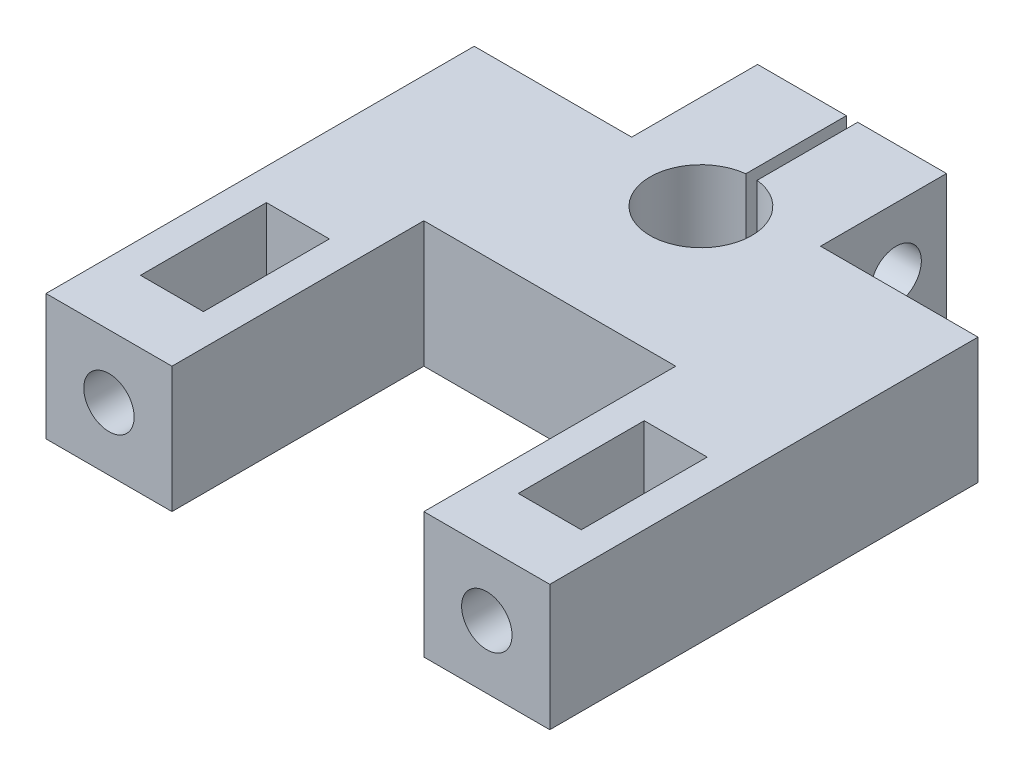
ISO-10303-21;
HEADER;
FILE_DESCRIPTION(('STEP AP214'),'2;1');
FILE_NAME('part.step','',(''),(''),'','','');
FILE_SCHEMA(('AUTOMOTIVE_DESIGN { 1 0 10303 214 1 1 1 1 }'));
ENDSEC;
DATA;
#1=APPLICATION_CONTEXT('core data for automotive mechanical design processes');
#2=APPLICATION_PROTOCOL_DEFINITION('international standard','automotive_design',2000,#1);
#3=PRODUCT_CONTEXT('',#1,'mechanical');
#4=PRODUCT('Part','Part','',(#3));
#5=PRODUCT_RELATED_PRODUCT_CATEGORY('part','',(#4));
#6=PRODUCT_DEFINITION_FORMATION('','',#4);
#7=PRODUCT_DEFINITION_CONTEXT('part definition',#1,'design');
#8=PRODUCT_DEFINITION('design','',#6,#7);
#9=PRODUCT_DEFINITION_SHAPE('','',#8);
#10=(LENGTH_UNIT() NAMED_UNIT(*) SI_UNIT(.MILLI.,.METRE.));
#11=(NAMED_UNIT(*) PLANE_ANGLE_UNIT() SI_UNIT($,.RADIAN.));
#12=(NAMED_UNIT(*) SI_UNIT($,.STERADIAN.) SOLID_ANGLE_UNIT());
#13=UNCERTAINTY_MEASURE_WITH_UNIT(LENGTH_MEASURE(1.E-05),#10,'distance_accuracy_value','');
#14=(GEOMETRIC_REPRESENTATION_CONTEXT(3) GLOBAL_UNCERTAINTY_ASSIGNED_CONTEXT((#13)) GLOBAL_UNIT_ASSIGNED_CONTEXT((#10,
#11,#12)) REPRESENTATION_CONTEXT('',''));
#15=CARTESIAN_POINT('',(0.,0.,0.));
#16=DIRECTION('',(0.,0.,1.));
#17=DIRECTION('',(1.,0.,0.));
#18=AXIS2_PLACEMENT_3D('',#15,#16,#17);
#19=CARTESIAN_POINT('',(-20.,0.,-34.));
#20=DIRECTION('',(0.,0.,-1.));
#21=DIRECTION('',(-1.,0.,0.));
#22=AXIS2_PLACEMENT_3D('',#19,#20,#21);
#23=PLANE('',#22);
#24=DIRECTION('',(0.,1.,0.));
#25=VECTOR('',#24,1.);
#26=CARTESIAN_POINT('',(7.5,-30.,-34.));
#27=LINE('',#26,#25);
#28=CARTESIAN_POINT('',(7.5,0.,-34.));
#29=VERTEX_POINT('',#28);
#30=CARTESIAN_POINT('',(7.5,10.,-34.));
#31=VERTEX_POINT('',#30);
#32=EDGE_CURVE('E286',#29,#31,#27,.T.);
#33=ORIENTED_EDGE('',*,*,#32,.F.);
#34=DIRECTION('',(-1.,0.,0.));
#35=VECTOR('',#34,1.);
#36=CARTESIAN_POINT('',(-20.,0.,-34.));
#37=LINE('',#36,#35);
#38=CARTESIAN_POINT('',(0.45,0.,-34.));
#39=VERTEX_POINT('',#38);
#40=EDGE_CURVE('E322',#29,#39,#37,.T.);
#41=ORIENTED_EDGE('',*,*,#40,.T.);
#42=DIRECTION('',(0.,1.,0.));
#43=VECTOR('',#42,1.);
#44=CARTESIAN_POINT('',(0.45,0.,-34.));
#45=LINE('',#44,#43);
#46=CARTESIAN_POINT('',(0.45,10.,-34.));
#47=VERTEX_POINT('',#46);
#48=EDGE_CURVE('E307',#39,#47,#45,.T.);
#49=ORIENTED_EDGE('',*,*,#48,.T.);
#50=DIRECTION('',(-1.,0.,0.));
#51=VECTOR('',#50,1.);
#52=CARTESIAN_POINT('',(-20.,10.,-34.));
#53=LINE('',#52,#51);
#54=EDGE_CURVE('E326',#31,#47,#53,.T.);
#55=ORIENTED_EDGE('',*,*,#54,.F.);
#56=EDGE_LOOP('',(#33,#41,#49,#55));
#57=FACE_BOUND('',#56,.T.);
#58=ADVANCED_FACE('F34',(#57),#23,.T.);
#59=CARTESIAN_POINT('',(10.,10.,10.));
#60=DIRECTION('',(1.,0.,0.));
#61=DIRECTION('',(0.,0.,-1.));
#62=AXIS2_PLACEMENT_3D('',#59,#60,#61);
#63=PLANE('',#62);
#64=DIRECTION('',(0.,0.,1.));
#65=VECTOR('',#64,1.);
#66=CARTESIAN_POINT('',(10.,0.,10.));
#67=LINE('',#66,#65);
#68=CARTESIAN_POINT('',(10.,0.,-10.));
#69=VERTEX_POINT('',#68);
#70=CARTESIAN_POINT('',(10.,0.,10.));
#71=VERTEX_POINT('',#70);
#72=EDGE_CURVE('E333',#69,#71,#67,.T.);
#73=ORIENTED_EDGE('',*,*,#72,.T.);
#74=DIRECTION('',(0.,-1.,0.));
#75=VECTOR('',#74,1.);
#76=CARTESIAN_POINT('',(10.,10.,10.));
#77=LINE('',#76,#75);
#78=CARTESIAN_POINT('',(10.,10.,10.));
#79=VERTEX_POINT('',#78);
#80=EDGE_CURVE('E380',#79,#71,#77,.T.);
#81=ORIENTED_EDGE('',*,*,#80,.F.);
#82=DIRECTION('',(0.,0.,1.));
#83=VECTOR('',#82,1.);
#84=CARTESIAN_POINT('',(10.,10.,10.));
#85=LINE('',#84,#83);
#86=CARTESIAN_POINT('',(10.,10.,-10.));
#87=VERTEX_POINT('',#86);
#88=EDGE_CURVE('E334',#87,#79,#85,.T.);
#89=ORIENTED_EDGE('',*,*,#88,.F.);
#90=DIRECTION('',(0.,-1.,0.));
#91=VECTOR('',#90,1.);
#92=CARTESIAN_POINT('',(10.,10.,-10.));
#93=LINE('',#92,#91);
#94=EDGE_CURVE('E351',#87,#69,#93,.T.);
#95=ORIENTED_EDGE('',*,*,#94,.T.);
#96=EDGE_LOOP('',(#73,#81,#89,#95));
#97=FACE_BOUND('',#96,.T.);
#98=ADVANCED_FACE('F36',(#97),#63,.F.);
#99=CARTESIAN_POINT('',(10.,10.,10.));
#100=DIRECTION('',(0.,0.,-1.));
#101=DIRECTION('',(-1.,0.,0.));
#102=AXIS2_PLACEMENT_3D('',#99,#100,#101);
#103=PLANE('',#102);
#104=CARTESIAN_POINT('',(15.,5.,10.));
#105=DIRECTION('',(0.,0.,1.));
#106=DIRECTION('',(1.,0.,0.));
#107=AXIS2_PLACEMENT_3D('',#104,#105,#106);
#108=CIRCLE('',#107,2.);
#109=CARTESIAN_POINT('',(17.,5.,10.));
#110=VERTEX_POINT('',#109);
#111=EDGE_CURVE('E324',#110,#110,#108,.T.);
#112=ORIENTED_EDGE('',*,*,#111,.F.);
#113=EDGE_LOOP('',(#112));
#114=FACE_BOUND('',#113,.T.);
#115=DIRECTION('',(1.,0.,0.));
#116=VECTOR('',#115,1.);
#117=CARTESIAN_POINT('',(10.,0.,10.));
#118=LINE('',#117,#116);
#119=CARTESIAN_POINT('',(20.,0.,10.));
#120=VERTEX_POINT('',#119);
#121=EDGE_CURVE('E354',#71,#120,#118,.T.);
#122=ORIENTED_EDGE('',*,*,#121,.T.);
#123=DIRECTION('',(0.,-1.,0.));
#124=VECTOR('',#123,1.);
#125=CARTESIAN_POINT('',(20.,10.,10.));
#126=LINE('',#125,#124);
#127=CARTESIAN_POINT('',(20.,10.,10.));
#128=VERTEX_POINT('',#127);
#129=EDGE_CURVE('E377',#128,#120,#126,.T.);
#130=ORIENTED_EDGE('',*,*,#129,.F.);
#131=DIRECTION('',(1.,0.,0.));
#132=VECTOR('',#131,1.);
#133=CARTESIAN_POINT('',(10.,10.,10.));
#134=LINE('',#133,#132);
#135=EDGE_CURVE('E337',#79,#128,#134,.T.);
#136=ORIENTED_EDGE('',*,*,#135,.F.);
#137=ORIENTED_EDGE('',*,*,#80,.T.);
#138=EDGE_LOOP('',(#122,#130,#136,#137));
#139=FACE_BOUND('',#138,.T.);
#140=ADVANCED_FACE('F428',(#114,#139),#103,.F.);
#141=CARTESIAN_POINT('',(20.,10.,10.));
#142=DIRECTION('',(-1.,0.,0.));
#143=DIRECTION('',(0.,0.,1.));
#144=AXIS2_PLACEMENT_3D('',#141,#142,#143);
#145=PLANE('',#144);
#146=DIRECTION('',(0.,0.,-1.));
#147=VECTOR('',#146,1.);
#148=CARTESIAN_POINT('',(20.,0.,10.));
#149=LINE('',#148,#147);
#150=CARTESIAN_POINT('',(20.,0.,-24.));
#151=VERTEX_POINT('',#150);
#152=EDGE_CURVE('E356',#120,#151,#149,.T.);
#153=ORIENTED_EDGE('',*,*,#152,.T.);
#154=DIRECTION('',(0.,1.,0.));
#155=VECTOR('',#154,1.);
#156=CARTESIAN_POINT('',(20.,-30.,-24.));
#157=LINE('',#156,#155);
#158=CARTESIAN_POINT('',(20.,10.,-24.));
#159=VERTEX_POINT('',#158);
#160=EDGE_CURVE('E289',#151,#159,#157,.T.);
#161=ORIENTED_EDGE('',*,*,#160,.T.);
#162=DIRECTION('',(0.,0.,-1.));
#163=VECTOR('',#162,1.);
#164=CARTESIAN_POINT('',(20.,10.,10.));
#165=LINE('',#164,#163);
#166=EDGE_CURVE('E340',#128,#159,#165,.T.);
#167=ORIENTED_EDGE('',*,*,#166,.F.);
#168=ORIENTED_EDGE('',*,*,#129,.T.);
#169=EDGE_LOOP('',(#153,#161,#167,#168));
#170=FACE_BOUND('',#169,.T.);
#171=ADVANCED_FACE('F497',(#170),#145,.F.);
#172=CARTESIAN_POINT('',(-20.,10.,10.));
#173=DIRECTION('',(1.,0.,0.));
#174=DIRECTION('',(0.,0.,-1.));
#175=AXIS2_PLACEMENT_3D('',#172,#173,#174);
#176=PLANE('',#175);
#177=DIRECTION('',(0.,0.,1.));
#178=VECTOR('',#177,1.);
#179=CARTESIAN_POINT('',(-20.,10.,10.));
#180=LINE('',#179,#178);
#181=CARTESIAN_POINT('',(-20.,10.,-24.));
#182=VERTEX_POINT('',#181);
#183=CARTESIAN_POINT('',(-20.,10.,10.));
#184=VERTEX_POINT('',#183);
#185=EDGE_CURVE('E343',#182,#184,#180,.T.);
#186=ORIENTED_EDGE('',*,*,#185,.F.);
#187=DIRECTION('',(0.,1.,0.));
#188=VECTOR('',#187,1.);
#189=CARTESIAN_POINT('',(-20.,-30.,-24.));
#190=LINE('',#189,#188);
#191=CARTESIAN_POINT('',(-20.,0.,-24.));
#192=VERTEX_POINT('',#191);
#193=EDGE_CURVE('E270',#192,#182,#190,.T.);
#194=ORIENTED_EDGE('',*,*,#193,.F.);
#195=DIRECTION('',(0.,0.,1.));
#196=VECTOR('',#195,1.);
#197=CARTESIAN_POINT('',(-20.,0.,10.));
#198=LINE('',#197,#196);
#199=CARTESIAN_POINT('',(-20.,0.,10.));
#200=VERTEX_POINT('',#199);
#201=EDGE_CURVE('E359',#192,#200,#198,.T.);
#202=ORIENTED_EDGE('',*,*,#201,.T.);
#203=DIRECTION('',(0.,-1.,0.));
#204=VECTOR('',#203,1.);
#205=CARTESIAN_POINT('',(-20.,10.,10.));
#206=LINE('',#205,#204);
#207=EDGE_CURVE('E374',#184,#200,#206,.T.);
#208=ORIENTED_EDGE('',*,*,#207,.F.);
#209=EDGE_LOOP('',(#186,#194,#202,#208));
#210=FACE_BOUND('',#209,.T.);
#211=ADVANCED_FACE('F472',(#210),#176,.F.);
#212=CARTESIAN_POINT('',(-20.,10.,10.));
#213=DIRECTION('',(0.,0.,-1.));
#214=DIRECTION('',(-1.,0.,0.));
#215=AXIS2_PLACEMENT_3D('',#212,#213,#214);
#216=PLANE('',#215);
#217=CARTESIAN_POINT('',(-15.,5.,10.));
#218=DIRECTION('',(0.,0.,1.));
#219=DIRECTION('',(1.,0.,0.));
#220=AXIS2_PLACEMENT_3D('',#217,#218,#219);
#221=CIRCLE('',#220,2.);
#222=CARTESIAN_POINT('',(-13.,5.,10.));
#223=VERTEX_POINT('',#222);
#224=EDGE_CURVE('E330',#223,#223,#221,.T.);
#225=ORIENTED_EDGE('',*,*,#224,.F.);
#226=EDGE_LOOP('',(#225));
#227=FACE_BOUND('',#226,.T.);
#228=DIRECTION('',(1.,0.,0.));
#229=VECTOR('',#228,1.);
#230=CARTESIAN_POINT('',(-20.,0.,10.));
#231=LINE('',#230,#229);
#232=CARTESIAN_POINT('',(-10.,0.,10.));
#233=VERTEX_POINT('',#232);
#234=EDGE_CURVE('E361',#200,#233,#231,.T.);
#235=ORIENTED_EDGE('',*,*,#234,.T.);
#236=DIRECTION('',(0.,-1.,0.));
#237=VECTOR('',#236,1.);
#238=CARTESIAN_POINT('',(-10.,10.,10.));
#239=LINE('',#238,#237);
#240=CARTESIAN_POINT('',(-10.,10.,10.));
#241=VERTEX_POINT('',#240);
#242=EDGE_CURVE('E371',#241,#233,#239,.T.);
#243=ORIENTED_EDGE('',*,*,#242,.F.);
#244=DIRECTION('',(1.,0.,0.));
#245=VECTOR('',#244,1.);
#246=CARTESIAN_POINT('',(-20.,10.,10.));
#247=LINE('',#246,#245);
#248=EDGE_CURVE('E345',#184,#241,#247,.T.);
#249=ORIENTED_EDGE('',*,*,#248,.F.);
#250=ORIENTED_EDGE('',*,*,#207,.T.);
#251=EDGE_LOOP('',(#235,#243,#249,#250));
#252=FACE_BOUND('',#251,.T.);
#253=ADVANCED_FACE('F477',(#227,#252),#216,.F.);
#254=CARTESIAN_POINT('',(-10.,10.,10.));
#255=DIRECTION('',(-1.,0.,0.));
#256=DIRECTION('',(0.,0.,1.));
#257=AXIS2_PLACEMENT_3D('',#254,#255,#256);
#258=PLANE('',#257);
#259=DIRECTION('',(0.,0.,-1.));
#260=VECTOR('',#259,1.);
#261=CARTESIAN_POINT('',(-10.,0.,10.));
#262=LINE('',#261,#260);
#263=CARTESIAN_POINT('',(-10.,0.,-10.));
#264=VERTEX_POINT('',#263);
#265=EDGE_CURVE('E363',#233,#264,#262,.T.);
#266=ORIENTED_EDGE('',*,*,#265,.T.);
#267=DIRECTION('',(0.,-1.,0.));
#268=VECTOR('',#267,1.);
#269=CARTESIAN_POINT('',(-10.,10.,-10.));
#270=LINE('',#269,#268);
#271=CARTESIAN_POINT('',(-10.,10.,-10.));
#272=VERTEX_POINT('',#271);
#273=EDGE_CURVE('E368',#272,#264,#270,.T.);
#274=ORIENTED_EDGE('',*,*,#273,.F.);
#275=DIRECTION('',(0.,0.,-1.));
#276=VECTOR('',#275,1.);
#277=CARTESIAN_POINT('',(-10.,10.,10.));
#278=LINE('',#277,#276);
#279=EDGE_CURVE('E347',#241,#272,#278,.T.);
#280=ORIENTED_EDGE('',*,*,#279,.F.);
#281=ORIENTED_EDGE('',*,*,#242,.T.);
#282=EDGE_LOOP('',(#266,#274,#280,#281));
#283=FACE_BOUND('',#282,.T.);
#284=ADVANCED_FACE('F483',(#283),#258,.F.);
#285=CARTESIAN_POINT('',(-10.,10.,-10.));
#286=DIRECTION('',(0.,0.,-1.));
#287=DIRECTION('',(-1.,0.,0.));
#288=AXIS2_PLACEMENT_3D('',#285,#286,#287);
#289=PLANE('',#288);
#290=DIRECTION('',(1.,0.,0.));
#291=VECTOR('',#290,1.);
#292=CARTESIAN_POINT('',(-10.,0.,-10.));
#293=LINE('',#292,#291);
#294=EDGE_CURVE('E338',#264,#69,#293,.T.);
#295=ORIENTED_EDGE('',*,*,#294,.T.);
#296=ORIENTED_EDGE('',*,*,#94,.F.);
#297=DIRECTION('',(1.,0.,0.));
#298=VECTOR('',#297,1.);
#299=CARTESIAN_POINT('',(-10.,10.,-10.));
#300=LINE('',#299,#298);
#301=EDGE_CURVE('E349',#272,#87,#300,.T.);
#302=ORIENTED_EDGE('',*,*,#301,.F.);
#303=ORIENTED_EDGE('',*,*,#273,.T.);
#304=EDGE_LOOP('',(#295,#296,#302,#303));
#305=FACE_BOUND('',#304,.T.);
#306=ADVANCED_FACE('F487',(#305),#289,.F.);
#307=CARTESIAN_POINT('',(0.,10.,0.));
#308=DIRECTION('',(0.,-1.,0.));
#309=DIRECTION('',(0.,0.,-1.));
#310=AXIS2_PLACEMENT_3D('',#307,#308,#309);
#311=PLANE('',#310);
#312=DIRECTION('',(-1.,0.,0.));
#313=VECTOR('',#312,1.);
#314=CARTESIAN_POINT('',(12.5,10.,-5.));
#315=LINE('',#314,#313);
#316=CARTESIAN_POINT('',(17.5,10.,-5.));
#317=VERTEX_POINT('',#316);
#318=CARTESIAN_POINT('',(12.5,10.,-5.));
#319=VERTEX_POINT('',#318);
#320=EDGE_CURVE('E223',#317,#319,#315,.T.);
#321=ORIENTED_EDGE('',*,*,#320,.F.);
#322=DIRECTION('',(0.,0.,-1.));
#323=VECTOR('',#322,1.);
#324=CARTESIAN_POINT('',(17.5,10.,-5.));
#325=LINE('',#324,#323);
#326=CARTESIAN_POINT('',(17.5,10.,5.));
#327=VERTEX_POINT('',#326);
#328=EDGE_CURVE('E51',#327,#317,#325,.T.);
#329=ORIENTED_EDGE('',*,*,#328,.F.);
#330=DIRECTION('',(1.,0.,0.));
#331=VECTOR('',#330,1.);
#332=CARTESIAN_POINT('',(12.5,10.,5.));
#333=LINE('',#332,#331);
#334=CARTESIAN_POINT('',(12.5,10.,5.));
#335=VERTEX_POINT('',#334);
#336=EDGE_CURVE('E214',#335,#327,#333,.T.);
#337=ORIENTED_EDGE('',*,*,#336,.F.);
#338=DIRECTION('',(0.,0.,1.));
#339=VECTOR('',#338,1.);
#340=CARTESIAN_POINT('',(12.5,10.,-5.));
#341=LINE('',#340,#339);
#342=EDGE_CURVE('E217',#319,#335,#341,.T.);
#343=ORIENTED_EDGE('',*,*,#342,.F.);
#344=EDGE_LOOP('',(#321,#329,#337,#343));
#345=FACE_BOUND('',#344,.T.);
#346=DIRECTION('',(-1.,0.,0.));
#347=VECTOR('',#346,1.);
#348=CARTESIAN_POINT('',(-17.5,10.,-5.));
#349=LINE('',#348,#347);
#350=CARTESIAN_POINT('',(-12.5,10.,-5.));
#351=VERTEX_POINT('',#350);
#352=CARTESIAN_POINT('',(-17.5,10.,-5.));
#353=VERTEX_POINT('',#352);
#354=EDGE_CURVE('E248',#351,#353,#349,.T.);
#355=ORIENTED_EDGE('',*,*,#354,.F.);
#356=DIRECTION('',(0.,0.,-1.));
#357=VECTOR('',#356,1.);
#358=CARTESIAN_POINT('',(-12.5,10.,-5.));
#359=LINE('',#358,#357);
#360=CARTESIAN_POINT('',(-12.5,10.,5.));
#361=VERTEX_POINT('',#360);
#362=EDGE_CURVE('E246',#361,#351,#359,.T.);
#363=ORIENTED_EDGE('',*,*,#362,.F.);
#364=DIRECTION('',(1.,0.,0.));
#365=VECTOR('',#364,1.);
#366=CARTESIAN_POINT('',(-17.5,10.,5.));
#367=LINE('',#366,#365);
#368=CARTESIAN_POINT('',(-17.5,10.,5.));
#369=VERTEX_POINT('',#368);
#370=EDGE_CURVE('E236',#369,#361,#367,.T.);
#371=ORIENTED_EDGE('',*,*,#370,.F.);
#372=DIRECTION('',(0.,0.,1.));
#373=VECTOR('',#372,1.);
#374=CARTESIAN_POINT('',(-17.5,10.,-5.));
#375=LINE('',#374,#373);
#376=EDGE_CURVE('E251',#353,#369,#375,.T.);
#377=ORIENTED_EDGE('',*,*,#376,.F.);
#378=EDGE_LOOP('',(#355,#363,#371,#377));
#379=FACE_BOUND('',#378,.T.);
#380=CARTESIAN_POINT('',(-0.45,10.,-34.));
#381=VERTEX_POINT('',#380);
#382=CARTESIAN_POINT('',(-7.5,10.,-34.));
#383=VERTEX_POINT('',#382);
#384=EDGE_CURVE('E319',#381,#383,#53,.T.);
#385=ORIENTED_EDGE('',*,*,#384,.T.);
#386=DIRECTION('',(0.,0.,-1.));
#387=VECTOR('',#386,1.);
#388=CARTESIAN_POINT('',(-7.5,10.,-34.));
#389=LINE('',#388,#387);
#390=CARTESIAN_POINT('',(-7.5,10.,-24.));
#391=VERTEX_POINT('',#390);
#392=EDGE_CURVE('E268',#391,#383,#389,.T.);
#393=ORIENTED_EDGE('',*,*,#392,.F.);
#394=DIRECTION('',(1.,0.,0.));
#395=VECTOR('',#394,1.);
#396=CARTESIAN_POINT('',(-20.,10.,-24.));
#397=LINE('',#396,#395);
#398=EDGE_CURVE('E265',#182,#391,#397,.T.);
#399=ORIENTED_EDGE('',*,*,#398,.F.);
#400=ORIENTED_EDGE('',*,*,#185,.T.);
#401=ORIENTED_EDGE('',*,*,#248,.T.);
#402=ORIENTED_EDGE('',*,*,#279,.T.);
#403=ORIENTED_EDGE('',*,*,#301,.T.);
#404=ORIENTED_EDGE('',*,*,#88,.T.);
#405=ORIENTED_EDGE('',*,*,#135,.T.);
#406=ORIENTED_EDGE('',*,*,#166,.T.);
#407=DIRECTION('',(1.,0.,0.));
#408=VECTOR('',#407,1.);
#409=CARTESIAN_POINT('',(7.5,10.,-24.));
#410=LINE('',#409,#408);
#411=CARTESIAN_POINT('',(7.5,10.,-24.));
#412=VERTEX_POINT('',#411);
#413=EDGE_CURVE('E283',#412,#159,#410,.T.);
#414=ORIENTED_EDGE('',*,*,#413,.F.);
#415=DIRECTION('',(0.,0.,1.));
#416=VECTOR('',#415,1.);
#417=CARTESIAN_POINT('',(7.5,10.,-34.));
#418=LINE('',#417,#416);
#419=EDGE_CURVE('E280',#31,#412,#418,.T.);
#420=ORIENTED_EDGE('',*,*,#419,.F.);
#421=ORIENTED_EDGE('',*,*,#54,.T.);
#422=DIRECTION('',(0.,0.,-1.));
#423=VECTOR('',#422,1.);
#424=CARTESIAN_POINT('',(0.45,10.,-22.));
#425=LINE('',#424,#423);
#426=CARTESIAN_POINT('',(0.45,10.,-26.0148598979292));
#427=VERTEX_POINT('',#426);
#428=EDGE_CURVE('E299',#427,#47,#425,.T.);
#429=ORIENTED_EDGE('',*,*,#428,.F.);
#430=CARTESIAN_POINT('',(0.,10.,-22.));
#431=DIRECTION('',(0.,1.,0.));
#432=DIRECTION('',(0.,0.,1.));
#433=AXIS2_PLACEMENT_3D('',#430,#431,#432);
#434=CIRCLE('',#433,4.04);
#435=CARTESIAN_POINT('',(-0.45,10.,-26.0148598979292));
#436=VERTEX_POINT('',#435);
#437=EDGE_CURVE('E313',#436,#427,#434,.T.);
#438=ORIENTED_EDGE('',*,*,#437,.F.);
#439=DIRECTION('',(0.,0.,1.));
#440=VECTOR('',#439,1.);
#441=CARTESIAN_POINT('',(-0.45,10.,-22.));
#442=LINE('',#441,#440);
#443=EDGE_CURVE('E304',#381,#436,#442,.T.);
#444=ORIENTED_EDGE('',*,*,#443,.F.);
#445=EDGE_LOOP('',(#385,#393,#399,#400,#401,#402,#403,#404,#405,#406,#414,#420,#421,#429,#438,#444));
#446=FACE_BOUND('',#445,.T.);
#447=ADVANCED_FACE('F456',(#345,#379,#446),#311,.F.);
#448=CARTESIAN_POINT('',(0.,0.,0.));
#449=DIRECTION('',(0.,-1.,0.));
#450=DIRECTION('',(0.,0.,-1.));
#451=AXIS2_PLACEMENT_3D('',#448,#449,#450);
#452=PLANE('',#451);
#453=DIRECTION('',(0.,0.,-1.));
#454=VECTOR('',#453,1.);
#455=CARTESIAN_POINT('',(17.5,0.,-5.));
#456=LINE('',#455,#454);
#457=CARTESIAN_POINT('',(17.5,0.,5.));
#458=VERTEX_POINT('',#457);
#459=CARTESIAN_POINT('',(17.5,0.,-5.));
#460=VERTEX_POINT('',#459);
#461=EDGE_CURVE('E198',#458,#460,#456,.T.);
#462=ORIENTED_EDGE('',*,*,#461,.T.);
#463=DIRECTION('',(-1.,0.,0.));
#464=VECTOR('',#463,1.);
#465=CARTESIAN_POINT('',(12.5,0.,-5.));
#466=LINE('',#465,#464);
#467=CARTESIAN_POINT('',(12.5,0.,-5.));
#468=VERTEX_POINT('',#467);
#469=EDGE_CURVE('E207',#460,#468,#466,.T.);
#470=ORIENTED_EDGE('',*,*,#469,.T.);
#471=DIRECTION('',(0.,0.,1.));
#472=VECTOR('',#471,1.);
#473=CARTESIAN_POINT('',(12.5,0.,-5.));
#474=LINE('',#473,#472);
#475=CARTESIAN_POINT('',(12.5,0.,5.));
#476=VERTEX_POINT('',#475);
#477=EDGE_CURVE('E59',#468,#476,#474,.T.);
#478=ORIENTED_EDGE('',*,*,#477,.T.);
#479=DIRECTION('',(1.,0.,0.));
#480=VECTOR('',#479,1.);
#481=CARTESIAN_POINT('',(12.5,0.,5.));
#482=LINE('',#481,#480);
#483=EDGE_CURVE('E204',#476,#458,#482,.T.);
#484=ORIENTED_EDGE('',*,*,#483,.T.);
#485=EDGE_LOOP('',(#462,#470,#478,#484));
#486=FACE_BOUND('',#485,.T.);
#487=DIRECTION('',(0.,0.,-1.));
#488=VECTOR('',#487,1.);
#489=CARTESIAN_POINT('',(-12.5,0.,-5.));
#490=LINE('',#489,#488);
#491=CARTESIAN_POINT('',(-12.5,0.,5.));
#492=VERTEX_POINT('',#491);
#493=CARTESIAN_POINT('',(-12.5,0.,-5.));
#494=VERTEX_POINT('',#493);
#495=EDGE_CURVE('E232',#492,#494,#490,.T.);
#496=ORIENTED_EDGE('',*,*,#495,.T.);
#497=DIRECTION('',(-1.,0.,0.));
#498=VECTOR('',#497,1.);
#499=CARTESIAN_POINT('',(-17.5,0.,-5.));
#500=LINE('',#499,#498);
#501=CARTESIAN_POINT('',(-17.5,0.,-5.));
#502=VERTEX_POINT('',#501);
#503=EDGE_CURVE('E235',#494,#502,#500,.T.);
#504=ORIENTED_EDGE('',*,*,#503,.T.);
#505=DIRECTION('',(0.,0.,1.));
#506=VECTOR('',#505,1.);
#507=CARTESIAN_POINT('',(-17.5,0.,-5.));
#508=LINE('',#507,#506);
#509=CARTESIAN_POINT('',(-17.5,0.,5.));
#510=VERTEX_POINT('',#509);
#511=EDGE_CURVE('E239',#502,#510,#508,.T.);
#512=ORIENTED_EDGE('',*,*,#511,.T.);
#513=DIRECTION('',(1.,0.,0.));
#514=VECTOR('',#513,1.);
#515=CARTESIAN_POINT('',(-17.5,0.,5.));
#516=LINE('',#515,#514);
#517=EDGE_CURVE('E242',#510,#492,#516,.T.);
#518=ORIENTED_EDGE('',*,*,#517,.T.);
#519=EDGE_LOOP('',(#496,#504,#512,#518));
#520=FACE_BOUND('',#519,.T.);
#521=DIRECTION('',(0.,0.,1.));
#522=VECTOR('',#521,1.);
#523=CARTESIAN_POINT('',(-7.5,0.,0.));
#524=LINE('',#523,#522);
#525=CARTESIAN_POINT('',(-7.5,0.,-34.));
#526=VERTEX_POINT('',#525);
#527=CARTESIAN_POINT('',(-7.5,0.,-24.));
#528=VERTEX_POINT('',#527);
#529=EDGE_CURVE('E278',#526,#528,#524,.T.);
#530=ORIENTED_EDGE('',*,*,#529,.F.);
#531=CARTESIAN_POINT('',(-0.45,0.,-34.));
#532=VERTEX_POINT('',#531);
#533=EDGE_CURVE('E325',#532,#526,#37,.T.);
#534=ORIENTED_EDGE('',*,*,#533,.F.);
#535=DIRECTION('',(0.,0.,1.));
#536=VECTOR('',#535,1.);
#537=CARTESIAN_POINT('',(-0.45,0.,-22.));
#538=LINE('',#537,#536);
#539=CARTESIAN_POINT('',(-0.45,0.,-26.0148598979292));
#540=VERTEX_POINT('',#539);
#541=EDGE_CURVE('E303',#532,#540,#538,.T.);
#542=ORIENTED_EDGE('',*,*,#541,.T.);
#543=CARTESIAN_POINT('',(0.,0.,-22.));
#544=DIRECTION('',(0.,1.,0.));
#545=DIRECTION('',(0.,0.,1.));
#546=AXIS2_PLACEMENT_3D('',#543,#544,#545);
#547=CIRCLE('',#546,4.04);
#548=CARTESIAN_POINT('',(0.45,0.,-26.0148598979292));
#549=VERTEX_POINT('',#548);
#550=EDGE_CURVE('E316',#540,#549,#547,.T.);
#551=ORIENTED_EDGE('',*,*,#550,.T.);
#552=DIRECTION('',(0.,0.,-1.));
#553=VECTOR('',#552,1.);
#554=CARTESIAN_POINT('',(0.45,0.,-22.));
#555=LINE('',#554,#553);
#556=EDGE_CURVE('E300',#549,#39,#555,.T.);
#557=ORIENTED_EDGE('',*,*,#556,.T.);
#558=ORIENTED_EDGE('',*,*,#40,.F.);
#559=DIRECTION('',(0.,0.,-1.));
#560=VECTOR('',#559,1.);
#561=CARTESIAN_POINT('',(7.5,0.,0.));
#562=LINE('',#561,#560);
#563=CARTESIAN_POINT('',(7.5,0.,-24.));
#564=VERTEX_POINT('',#563);
#565=EDGE_CURVE('E293',#564,#29,#562,.T.);
#566=ORIENTED_EDGE('',*,*,#565,.F.);
#567=DIRECTION('',(-1.,0.,0.));
#568=VECTOR('',#567,1.);
#569=CARTESIAN_POINT('',(0.,0.,-24.));
#570=LINE('',#569,#568);
#571=EDGE_CURVE('E43',#151,#564,#570,.T.);
#572=ORIENTED_EDGE('',*,*,#571,.F.);
#573=ORIENTED_EDGE('',*,*,#152,.F.);
#574=ORIENTED_EDGE('',*,*,#121,.F.);
#575=ORIENTED_EDGE('',*,*,#72,.F.);
#576=ORIENTED_EDGE('',*,*,#294,.F.);
#577=ORIENTED_EDGE('',*,*,#265,.F.);
#578=ORIENTED_EDGE('',*,*,#234,.F.);
#579=ORIENTED_EDGE('',*,*,#201,.F.);
#580=DIRECTION('',(-1.,0.,0.));
#581=VECTOR('',#580,1.);
#582=CARTESIAN_POINT('',(0.,0.,-24.));
#583=LINE('',#582,#581);
#584=EDGE_CURVE('E11',#528,#192,#583,.T.);
#585=ORIENTED_EDGE('',*,*,#584,.F.);
#586=EDGE_LOOP('',(#530,#534,#542,#551,#557,#558,#566,#572,#573,#574,#575,#576,#577,#578,#579,#585));
#587=FACE_BOUND('',#586,.T.);
#588=ADVANCED_FACE('F211',(#486,#520,#587),#452,.T.);
#589=CARTESIAN_POINT('',(-15.,5.,-5.));
#590=DIRECTION('',(0.,0.,1.));
#591=DIRECTION('',(1.,0.,0.));
#592=AXIS2_PLACEMENT_3D('',#589,#590,#591);
#593=CYLINDRICAL_SURFACE('',#592,2.);
#594=CARTESIAN_POINT('',(-15.,5.,5.));
#595=DIRECTION('',(0.,0.,1.));
#596=DIRECTION('',(1.,0.,0.));
#597=AXIS2_PLACEMENT_3D('',#594,#595,#596);
#598=CIRCLE('',#597,2.);
#599=CARTESIAN_POINT('',(-13.,5.,5.));
#600=VERTEX_POINT('',#599);
#601=EDGE_CURVE('E258',#600,#600,#598,.F.);
#602=ORIENTED_EDGE('',*,*,#601,.T.);
#603=EDGE_LOOP('',(#602));
#604=FACE_BOUND('',#603,.T.);
#605=ORIENTED_EDGE('',*,*,#224,.T.);
#606=EDGE_LOOP('',(#605));
#607=FACE_BOUND('',#606,.T.);
#608=ADVANCED_FACE('F398',(#604,#607),#593,.F.);
#609=CARTESIAN_POINT('',(15.,5.,-5.));
#610=DIRECTION('',(0.,0.,1.));
#611=DIRECTION('',(1.,0.,0.));
#612=AXIS2_PLACEMENT_3D('',#609,#610,#611);
#613=CYLINDRICAL_SURFACE('',#612,2.);
#614=CARTESIAN_POINT('',(15.,5.,5.));
#615=DIRECTION('',(0.,0.,1.));
#616=DIRECTION('',(1.,0.,0.));
#617=AXIS2_PLACEMENT_3D('',#614,#615,#616);
#618=CIRCLE('',#617,2.);
#619=CARTESIAN_POINT('',(17.,5.,5.));
#620=VERTEX_POINT('',#619);
#621=EDGE_CURVE('E38',#620,#620,#618,.F.);
#622=ORIENTED_EDGE('',*,*,#621,.T.);
#623=EDGE_LOOP('',(#622));
#624=FACE_BOUND('',#623,.T.);
#625=ORIENTED_EDGE('',*,*,#111,.T.);
#626=EDGE_LOOP('',(#625));
#627=FACE_BOUND('',#626,.T.);
#628=ADVANCED_FACE('F435',(#624,#627),#613,.F.);
#629=DIRECTION('',(0.,1.,0.));
#630=VECTOR('',#629,1.);
#631=CARTESIAN_POINT('',(-7.5,-30.,-34.));
#632=LINE('',#631,#630);
#633=EDGE_CURVE('E271',#526,#383,#632,.T.);
#634=ORIENTED_EDGE('',*,*,#633,.T.);
#635=ORIENTED_EDGE('',*,*,#384,.F.);
#636=DIRECTION('',(0.,1.,0.));
#637=VECTOR('',#636,1.);
#638=CARTESIAN_POINT('',(-0.45,0.,-34.));
#639=LINE('',#638,#637);
#640=EDGE_CURVE('E311',#532,#381,#639,.T.);
#641=ORIENTED_EDGE('',*,*,#640,.F.);
#642=ORIENTED_EDGE('',*,*,#533,.T.);
#643=EDGE_LOOP('',(#634,#635,#641,#642));
#644=FACE_BOUND('',#643,.T.);
#645=ADVANCED_FACE('F422',(#644),#23,.T.);
#646=CARTESIAN_POINT('',(0.,0.,-22.));
#647=DIRECTION('',(0.,1.,0.));
#648=DIRECTION('',(0.,0.,1.));
#649=AXIS2_PLACEMENT_3D('',#646,#647,#648);
#650=CYLINDRICAL_SURFACE('',#649,4.04);
#651=ORIENTED_EDGE('',*,*,#437,.T.);
#652=DIRECTION('',(0.,1.,0.));
#653=VECTOR('',#652,1.);
#654=CARTESIAN_POINT('',(0.45,0.,-26.0148598979292));
#655=LINE('',#654,#653);
#656=EDGE_CURVE('E386',#427,#549,#655,.F.);
#657=ORIENTED_EDGE('',*,*,#656,.T.);
#658=ORIENTED_EDGE('',*,*,#550,.F.);
#659=DIRECTION('',(0.,1.,0.));
#660=VECTOR('',#659,1.);
#661=CARTESIAN_POINT('',(-0.45,0.,-26.0148598979292));
#662=LINE('',#661,#660);
#663=EDGE_CURVE('E383',#540,#436,#662,.T.);
#664=ORIENTED_EDGE('',*,*,#663,.T.);
#665=EDGE_LOOP('',(#651,#657,#658,#664));
#666=FACE_BOUND('',#665,.T.);
#667=ADVANCED_FACE('F434',(#666),#650,.F.);
#668=CARTESIAN_POINT('',(-0.45,0.,-22.));
#669=DIRECTION('',(-1.,0.,0.));
#670=DIRECTION('',(0.,0.,1.));
#671=AXIS2_PLACEMENT_3D('',#668,#669,#670);
#672=PLANE('',#671);
#673=CARTESIAN_POINT('',(-0.449999999999999,5.,-30.));
#674=DIRECTION('',(-1.,0.,0.));
#675=DIRECTION('',(0.,0.,1.));
#676=AXIS2_PLACEMENT_3D('',#673,#674,#675);
#677=CIRCLE('',#676,2.);
#678=CARTESIAN_POINT('',(-0.449999999999999,5.,-28.));
#679=VERTEX_POINT('',#678);
#680=EDGE_CURVE('E296',#679,#679,#677,.T.);
#681=ORIENTED_EDGE('',*,*,#680,.T.);
#682=EDGE_LOOP('',(#681));
#683=FACE_BOUND('',#682,.T.);
#684=ORIENTED_EDGE('',*,*,#541,.F.);
#685=ORIENTED_EDGE('',*,*,#640,.T.);
#686=ORIENTED_EDGE('',*,*,#443,.T.);
#687=ORIENTED_EDGE('',*,*,#663,.F.);
#688=EDGE_LOOP('',(#684,#685,#686,#687));
#689=FACE_BOUND('',#688,.T.);
#690=ADVANCED_FACE('F441',(#683,#689),#672,.F.);
#691=CARTESIAN_POINT('',(0.45,0.,-22.));
#692=DIRECTION('',(1.,0.,0.));
#693=DIRECTION('',(0.,0.,-1.));
#694=AXIS2_PLACEMENT_3D('',#691,#692,#693);
#695=PLANE('',#694);
#696=CARTESIAN_POINT('',(0.449999999999999,5.,-30.));
#697=DIRECTION('',(1.,0.,0.));
#698=DIRECTION('',(0.,0.,-1.));
#699=AXIS2_PLACEMENT_3D('',#696,#697,#698);
#700=CIRCLE('',#699,2.);
#701=CARTESIAN_POINT('',(0.449999999999999,5.,-32.));
#702=VERTEX_POINT('',#701);
#703=EDGE_CURVE('E295',#702,#702,#700,.T.);
#704=ORIENTED_EDGE('',*,*,#703,.T.);
#705=EDGE_LOOP('',(#704));
#706=FACE_BOUND('',#705,.T.);
#707=ORIENTED_EDGE('',*,*,#428,.T.);
#708=ORIENTED_EDGE('',*,*,#48,.F.);
#709=ORIENTED_EDGE('',*,*,#556,.F.);
#710=ORIENTED_EDGE('',*,*,#656,.F.);
#711=EDGE_LOOP('',(#707,#708,#709,#710));
#712=FACE_BOUND('',#711,.T.);
#713=ADVANCED_FACE('F510',(#706,#712),#695,.F.);
#714=CARTESIAN_POINT('',(20.,5.,-30.));
#715=DIRECTION('',(-1.,0.,0.));
#716=DIRECTION('',(0.,0.,1.));
#717=AXIS2_PLACEMENT_3D('',#714,#715,#716);
#718=CYLINDRICAL_SURFACE('',#717,2.);
#719=CARTESIAN_POINT('',(7.5,5.,-30.));
#720=DIRECTION('',(-1.,0.,0.));
#721=DIRECTION('',(0.,0.,1.));
#722=AXIS2_PLACEMENT_3D('',#719,#720,#721);
#723=CIRCLE('',#722,2.);
#724=CARTESIAN_POINT('',(7.5,5.,-28.));
#725=VERTEX_POINT('',#724);
#726=EDGE_CURVE('E288',#725,#725,#723,.F.);
#727=ORIENTED_EDGE('',*,*,#726,.T.);
#728=EDGE_LOOP('',(#727));
#729=FACE_BOUND('',#728,.T.);
#730=ORIENTED_EDGE('',*,*,#703,.F.);
#731=EDGE_LOOP('',(#730));
#732=FACE_BOUND('',#731,.T.);
#733=ADVANCED_FACE('F512',(#729,#732),#718,.F.);
#734=CARTESIAN_POINT('',(-7.5,5.,-30.));
#735=DIRECTION('',(1.,0.,0.));
#736=DIRECTION('',(0.,0.,-1.));
#737=AXIS2_PLACEMENT_3D('',#734,#735,#736);
#738=CIRCLE('',#737,2.);
#739=CARTESIAN_POINT('',(-7.5,5.,-32.));
#740=VERTEX_POINT('',#739);
#741=EDGE_CURVE('E274',#740,#740,#738,.F.);
#742=ORIENTED_EDGE('',*,*,#741,.T.);
#743=EDGE_LOOP('',(#742));
#744=FACE_BOUND('',#743,.T.);
#745=ORIENTED_EDGE('',*,*,#680,.F.);
#746=EDGE_LOOP('',(#745));
#747=FACE_BOUND('',#746,.T.);
#748=ADVANCED_FACE('F519',(#744,#747),#718,.F.);
#749=CARTESIAN_POINT('',(7.5,-30.,-34.));
#750=DIRECTION('',(-1.,0.,0.));
#751=DIRECTION('',(0.,0.,1.));
#752=AXIS2_PLACEMENT_3D('',#749,#750,#751);
#753=PLANE('',#752);
#754=ORIENTED_EDGE('',*,*,#565,.T.);
#755=ORIENTED_EDGE('',*,*,#32,.T.);
#756=ORIENTED_EDGE('',*,*,#419,.T.);
#757=DIRECTION('',(0.,1.,0.));
#758=VECTOR('',#757,1.);
#759=CARTESIAN_POINT('',(7.5,-30.,-24.));
#760=LINE('',#759,#758);
#761=EDGE_CURVE('E285',#564,#412,#760,.T.);
#762=ORIENTED_EDGE('',*,*,#761,.F.);
#763=EDGE_LOOP('',(#754,#755,#756,#762));
#764=FACE_BOUND('',#763,.T.);
#765=ORIENTED_EDGE('',*,*,#726,.F.);
#766=EDGE_LOOP('',(#765));
#767=FACE_BOUND('',#766,.T.);
#768=ADVANCED_FACE('F504',(#764,#767),#753,.F.);
#769=CARTESIAN_POINT('',(7.5,-30.,-24.));
#770=DIRECTION('',(0.,0.,1.));
#771=DIRECTION('',(1.,0.,0.));
#772=AXIS2_PLACEMENT_3D('',#769,#770,#771);
#773=PLANE('',#772);
#774=ORIENTED_EDGE('',*,*,#571,.T.);
#775=ORIENTED_EDGE('',*,*,#761,.T.);
#776=ORIENTED_EDGE('',*,*,#413,.T.);
#777=ORIENTED_EDGE('',*,*,#160,.F.);
#778=EDGE_LOOP('',(#774,#775,#776,#777));
#779=FACE_BOUND('',#778,.T.);
#780=ADVANCED_FACE('F500',(#779),#773,.F.);
#781=CARTESIAN_POINT('',(-7.5,-30.,-34.));
#782=DIRECTION('',(1.,0.,0.));
#783=DIRECTION('',(0.,0.,-1.));
#784=AXIS2_PLACEMENT_3D('',#781,#782,#783);
#785=PLANE('',#784);
#786=ORIENTED_EDGE('',*,*,#529,.T.);
#787=DIRECTION('',(0.,1.,0.));
#788=VECTOR('',#787,1.);
#789=CARTESIAN_POINT('',(-7.5,-30.,-24.));
#790=LINE('',#789,#788);
#791=EDGE_CURVE('E275',#528,#391,#790,.T.);
#792=ORIENTED_EDGE('',*,*,#791,.T.);
#793=ORIENTED_EDGE('',*,*,#392,.T.);
#794=ORIENTED_EDGE('',*,*,#633,.F.);
#795=EDGE_LOOP('',(#786,#792,#793,#794));
#796=FACE_BOUND('',#795,.T.);
#797=ORIENTED_EDGE('',*,*,#741,.F.);
#798=EDGE_LOOP('',(#797));
#799=FACE_BOUND('',#798,.T.);
#800=ADVANCED_FACE('F414',(#796,#799),#785,.F.);
#801=CARTESIAN_POINT('',(-20.,-30.,-24.));
#802=DIRECTION('',(0.,0.,1.));
#803=DIRECTION('',(1.,0.,0.));
#804=AXIS2_PLACEMENT_3D('',#801,#802,#803);
#805=PLANE('',#804);
#806=ORIENTED_EDGE('',*,*,#584,.T.);
#807=ORIENTED_EDGE('',*,*,#193,.T.);
#808=ORIENTED_EDGE('',*,*,#398,.T.);
#809=ORIENTED_EDGE('',*,*,#791,.F.);
#810=EDGE_LOOP('',(#806,#807,#808,#809));
#811=FACE_BOUND('',#810,.T.);
#812=ADVANCED_FACE('F404',(#811),#805,.F.);
#813=CARTESIAN_POINT('',(-17.5,0.,5.));
#814=DIRECTION('',(0.,0.,1.));
#815=DIRECTION('',(1.,0.,0.));
#816=AXIS2_PLACEMENT_3D('',#813,#814,#815);
#817=PLANE('',#816);
#818=ORIENTED_EDGE('',*,*,#370,.T.);
#819=DIRECTION('',(0.,1.,0.));
#820=VECTOR('',#819,1.);
#821=CARTESIAN_POINT('',(-12.5,0.,5.));
#822=LINE('',#821,#820);
#823=EDGE_CURVE('E256',#492,#361,#822,.T.);
#824=ORIENTED_EDGE('',*,*,#823,.F.);
#825=ORIENTED_EDGE('',*,*,#517,.F.);
#826=DIRECTION('',(0.,1.,0.));
#827=VECTOR('',#826,1.);
#828=CARTESIAN_POINT('',(-17.5,0.,5.));
#829=LINE('',#828,#827);
#830=EDGE_CURVE('E259',#510,#369,#829,.T.);
#831=ORIENTED_EDGE('',*,*,#830,.T.);
#832=EDGE_LOOP('',(#818,#824,#825,#831));
#833=FACE_BOUND('',#832,.T.);
#834=ORIENTED_EDGE('',*,*,#601,.F.);
#835=EDGE_LOOP('',(#834));
#836=FACE_BOUND('',#835,.T.);
#837=ADVANCED_FACE('F401',(#833,#836),#817,.F.);
#838=CARTESIAN_POINT('',(-12.5,0.,-5.));
#839=DIRECTION('',(1.,0.,0.));
#840=DIRECTION('',(0.,0.,-1.));
#841=AXIS2_PLACEMENT_3D('',#838,#839,#840);
#842=PLANE('',#841);
#843=ORIENTED_EDGE('',*,*,#362,.T.);
#844=DIRECTION('',(0.,1.,0.));
#845=VECTOR('',#844,1.);
#846=CARTESIAN_POINT('',(-12.5,0.,-5.));
#847=LINE('',#846,#845);
#848=EDGE_CURVE('E245',#494,#351,#847,.T.);
#849=ORIENTED_EDGE('',*,*,#848,.F.);
#850=ORIENTED_EDGE('',*,*,#495,.F.);
#851=ORIENTED_EDGE('',*,*,#823,.T.);
#852=EDGE_LOOP('',(#843,#849,#850,#851));
#853=FACE_BOUND('',#852,.T.);
#854=ADVANCED_FACE('F403',(#853),#842,.F.);
#855=CARTESIAN_POINT('',(-17.5,0.,-5.));
#856=DIRECTION('',(-1.,0.,0.));
#857=DIRECTION('',(0.,0.,1.));
#858=AXIS2_PLACEMENT_3D('',#855,#856,#857);
#859=PLANE('',#858);
#860=ORIENTED_EDGE('',*,*,#376,.T.);
#861=ORIENTED_EDGE('',*,*,#830,.F.);
#862=ORIENTED_EDGE('',*,*,#511,.F.);
#863=DIRECTION('',(0.,1.,0.));
#864=VECTOR('',#863,1.);
#865=CARTESIAN_POINT('',(-17.5,0.,-5.));
#866=LINE('',#865,#864);
#867=EDGE_CURVE('E261',#502,#353,#866,.T.);
#868=ORIENTED_EDGE('',*,*,#867,.T.);
#869=EDGE_LOOP('',(#860,#861,#862,#868));
#870=FACE_BOUND('',#869,.T.);
#871=ADVANCED_FACE('F411',(#870),#859,.F.);
#872=CARTESIAN_POINT('',(-15.,5.,-5.));
#873=DIRECTION('',(0.,0.,1.));
#874=DIRECTION('',(1.,0.,0.));
#875=AXIS2_PLACEMENT_3D('',#872,#873,#874);
#876=PLANE('',#875);
#877=ORIENTED_EDGE('',*,*,#354,.T.);
#878=ORIENTED_EDGE('',*,*,#867,.F.);
#879=ORIENTED_EDGE('',*,*,#503,.F.);
#880=ORIENTED_EDGE('',*,*,#848,.T.);
#881=EDGE_LOOP('',(#877,#878,#879,#880));
#882=FACE_BOUND('',#881,.T.);
#883=ADVANCED_FACE('F533',(#882),#876,.T.);
#884=CARTESIAN_POINT('',(12.5,0.,5.));
#885=DIRECTION('',(0.,0.,1.));
#886=DIRECTION('',(1.,0.,0.));
#887=AXIS2_PLACEMENT_3D('',#884,#885,#886);
#888=PLANE('',#887);
#889=ORIENTED_EDGE('',*,*,#336,.T.);
#890=DIRECTION('',(0.,1.,0.));
#891=VECTOR('',#890,1.);
#892=CARTESIAN_POINT('',(17.5,0.,5.));
#893=LINE('',#892,#891);
#894=EDGE_CURVE('E227',#458,#327,#893,.T.);
#895=ORIENTED_EDGE('',*,*,#894,.F.);
#896=ORIENTED_EDGE('',*,*,#483,.F.);
#897=DIRECTION('',(0.,1.,0.));
#898=VECTOR('',#897,1.);
#899=CARTESIAN_POINT('',(12.5,0.,5.));
#900=LINE('',#899,#898);
#901=EDGE_CURVE('E229',#476,#335,#900,.T.);
#902=ORIENTED_EDGE('',*,*,#901,.T.);
#903=EDGE_LOOP('',(#889,#895,#896,#902));
#904=FACE_BOUND('',#903,.T.);
#905=ORIENTED_EDGE('',*,*,#621,.F.);
#906=EDGE_LOOP('',(#905));
#907=FACE_BOUND('',#906,.T.);
#908=ADVANCED_FACE('F538',(#904,#907),#888,.F.);
#909=CARTESIAN_POINT('',(17.5,0.,-5.));
#910=DIRECTION('',(1.,0.,0.));
#911=DIRECTION('',(0.,0.,-1.));
#912=AXIS2_PLACEMENT_3D('',#909,#910,#911);
#913=PLANE('',#912);
#914=ORIENTED_EDGE('',*,*,#328,.T.);
#915=DIRECTION('',(0.,1.,0.));
#916=VECTOR('',#915,1.);
#917=CARTESIAN_POINT('',(17.5,0.,-5.));
#918=LINE('',#917,#916);
#919=EDGE_CURVE('E194',#460,#317,#918,.T.);
#920=ORIENTED_EDGE('',*,*,#919,.F.);
#921=ORIENTED_EDGE('',*,*,#461,.F.);
#922=ORIENTED_EDGE('',*,*,#894,.T.);
#923=EDGE_LOOP('',(#914,#920,#921,#922));
#924=FACE_BOUND('',#923,.T.);
#925=ADVANCED_FACE('F196',(#924),#913,.F.);
#926=CARTESIAN_POINT('',(12.5,0.,-5.));
#927=DIRECTION('',(-1.,0.,0.));
#928=DIRECTION('',(0.,0.,1.));
#929=AXIS2_PLACEMENT_3D('',#926,#927,#928);
#930=PLANE('',#929);
#931=ORIENTED_EDGE('',*,*,#342,.T.);
#932=ORIENTED_EDGE('',*,*,#901,.F.);
#933=ORIENTED_EDGE('',*,*,#477,.F.);
#934=DIRECTION('',(0.,1.,0.));
#935=VECTOR('',#934,1.);
#936=CARTESIAN_POINT('',(12.5,0.,-5.));
#937=LINE('',#936,#935);
#938=EDGE_CURVE('E203',#468,#319,#937,.T.);
#939=ORIENTED_EDGE('',*,*,#938,.T.);
#940=EDGE_LOOP('',(#931,#932,#933,#939));
#941=FACE_BOUND('',#940,.T.);
#942=ADVANCED_FACE('F636',(#941),#930,.F.);
#943=CARTESIAN_POINT('',(15.,5.,-5.));
#944=DIRECTION('',(0.,0.,1.));
#945=DIRECTION('',(1.,0.,0.));
#946=AXIS2_PLACEMENT_3D('',#943,#944,#945);
#947=PLANE('',#946);
#948=ORIENTED_EDGE('',*,*,#320,.T.);
#949=ORIENTED_EDGE('',*,*,#938,.F.);
#950=ORIENTED_EDGE('',*,*,#469,.F.);
#951=ORIENTED_EDGE('',*,*,#919,.T.);
#952=EDGE_LOOP('',(#948,#949,#950,#951));
#953=FACE_BOUND('',#952,.T.);
#954=ADVANCED_FACE('F208',(#953),#947,.T.);
#955=CLOSED_SHELL('',(#58,#98,#140,#171,#211,#253,#284,#306,#447,#588,#608,#628,#645,#667,#690,
#713,#733,#748,#768,#780,#800,#812,#837,#854,#871,#883,#908,#925,#942,#954));
#956=MANIFOLD_SOLID_BREP('B2',#955);
#957=ADVANCED_BREP_SHAPE_REPRESENTATION('',(#18,#956),#14);
#958=SHAPE_DEFINITION_REPRESENTATION(#9,#957);
ENDSEC;
END-ISO-10303-21;
